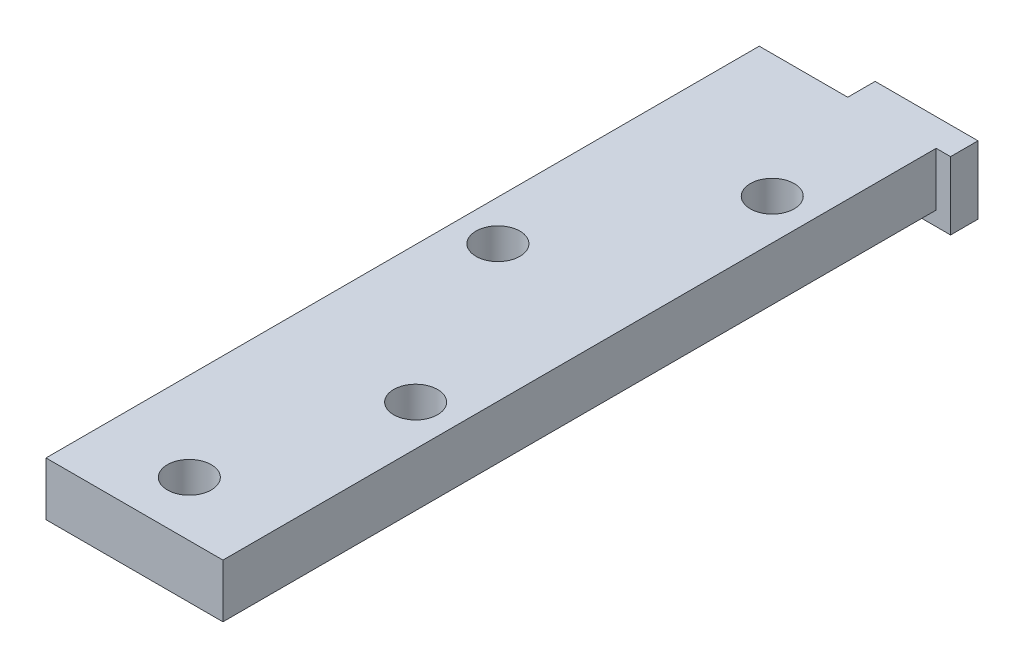
ISO-10303-21;
HEADER;
FILE_DESCRIPTION(('STEP AP214'),'2;1');
FILE_NAME('part.step','',(''),(''),'','','');
FILE_SCHEMA(('AUTOMOTIVE_DESIGN { 1 0 10303 214 1 1 1 1 }'));
ENDSEC;
DATA;
#1=APPLICATION_CONTEXT('core data for automotive mechanical design processes');
#2=APPLICATION_PROTOCOL_DEFINITION('international standard','automotive_design',2000,#1);
#3=PRODUCT_CONTEXT('',#1,'mechanical');
#4=PRODUCT('Part','Part','',(#3));
#5=PRODUCT_RELATED_PRODUCT_CATEGORY('part','',(#4));
#6=PRODUCT_DEFINITION_FORMATION('','',#4);
#7=PRODUCT_DEFINITION_CONTEXT('part definition',#1,'design');
#8=PRODUCT_DEFINITION('design','',#6,#7);
#9=PRODUCT_DEFINITION_SHAPE('','',#8);
#10=(LENGTH_UNIT() NAMED_UNIT(*) SI_UNIT(.MILLI.,.METRE.));
#11=(NAMED_UNIT(*) PLANE_ANGLE_UNIT() SI_UNIT($,.RADIAN.));
#12=(NAMED_UNIT(*) SI_UNIT($,.STERADIAN.) SOLID_ANGLE_UNIT());
#13=UNCERTAINTY_MEASURE_WITH_UNIT(LENGTH_MEASURE(1.E-05),#10,'distance_accuracy_value','');
#14=(GEOMETRIC_REPRESENTATION_CONTEXT(3) GLOBAL_UNCERTAINTY_ASSIGNED_CONTEXT((#13)) GLOBAL_UNIT_ASSIGNED_CONTEXT((#10,
#11,#12)) REPRESENTATION_CONTEXT('',''));
#15=CARTESIAN_POINT('',(0.,0.,0.));
#16=DIRECTION('',(0.,0.,1.));
#17=DIRECTION('',(1.,0.,0.));
#18=AXIS2_PLACEMENT_3D('',#15,#16,#17);
#19=CARTESIAN_POINT('',(7.5,-3.,2.));
#20=DIRECTION('',(-1.,0.,0.));
#21=DIRECTION('',(0.,0.,1.));
#22=AXIS2_PLACEMENT_3D('',#19,#20,#21);
#23=PLANE('',#22);
#24=DIRECTION('',(0.,1.,0.));
#25=VECTOR('',#24,1.);
#26=CARTESIAN_POINT('',(7.5,-3.,0.));
#27=LINE('',#26,#25);
#28=CARTESIAN_POINT('',(7.5,-3.,0.));
#29=VERTEX_POINT('',#28);
#30=CARTESIAN_POINT('',(7.5,1.95,0.));
#31=VERTEX_POINT('',#30);
#32=EDGE_CURVE('E116',#29,#31,#27,.T.);
#33=ORIENTED_EDGE('',*,*,#32,.T.);
#34=DIRECTION('',(0.,0.,1.));
#35=VECTOR('',#34,1.);
#36=CARTESIAN_POINT('',(7.5,1.95,-8.));
#37=LINE('',#36,#35);
#38=CARTESIAN_POINT('',(7.5,1.95,2.));
#39=VERTEX_POINT('',#38);
#40=EDGE_CURVE('E103',#31,#39,#37,.T.);
#41=ORIENTED_EDGE('',*,*,#40,.T.);
#42=DIRECTION('',(0.,1.,0.));
#43=VECTOR('',#42,1.);
#44=CARTESIAN_POINT('',(7.5,-3.,2.));
#45=LINE('',#44,#43);
#46=CARTESIAN_POINT('',(7.5,-3.,2.));
#47=VERTEX_POINT('',#46);
#48=EDGE_CURVE('E114',#47,#39,#45,.T.);
#49=ORIENTED_EDGE('',*,*,#48,.F.);
#50=DIRECTION('',(0.,0.,-1.));
#51=VECTOR('',#50,1.);
#52=CARTESIAN_POINT('',(7.5,-3.,2.));
#53=LINE('',#52,#51);
#54=EDGE_CURVE('E135',#47,#29,#53,.T.);
#55=ORIENTED_EDGE('',*,*,#54,.T.);
#56=EDGE_LOOP('',(#33,#41,#49,#55));
#57=FACE_BOUND('',#56,.T.);
#58=ADVANCED_FACE('F36',(#57),#23,.F.);
#59=CARTESIAN_POINT('',(0.,3.,2.));
#60=DIRECTION('',(1.,0.,0.));
#61=DIRECTION('',(0.,1.,0.));
#62=AXIS2_PLACEMENT_3D('',#59,#60,#61);
#63=PLANE('',#62);
#64=DIRECTION('',(0.,-1.,0.));
#65=VECTOR('',#64,1.);
#66=CARTESIAN_POINT('',(0.,3.,2.));
#67=LINE('',#66,#65);
#68=CARTESIAN_POINT('',(0.,1.95,2.));
#69=VERTEX_POINT('',#68);
#70=CARTESIAN_POINT('',(0.,-1.95,2.));
#71=VERTEX_POINT('',#70);
#72=EDGE_CURVE('E126',#69,#71,#67,.T.);
#73=ORIENTED_EDGE('',*,*,#72,.F.);
#74=DIRECTION('',(0.,0.,1.));
#75=VECTOR('',#74,1.);
#76=CARTESIAN_POINT('',(0.,1.95,-8.));
#77=LINE('',#76,#75);
#78=CARTESIAN_POINT('',(0.,1.95,0.));
#79=VERTEX_POINT('',#78);
#80=EDGE_CURVE('E57',#79,#69,#77,.T.);
#81=ORIENTED_EDGE('',*,*,#80,.F.);
#82=DIRECTION('',(0.,-1.,0.));
#83=VECTOR('',#82,1.);
#84=CARTESIAN_POINT('',(0.,3.,0.));
#85=LINE('',#84,#83);
#86=CARTESIAN_POINT('',(0.,-3.,0.));
#87=VERTEX_POINT('',#86);
#88=EDGE_CURVE('E128',#79,#87,#85,.T.);
#89=ORIENTED_EDGE('',*,*,#88,.T.);
#90=DIRECTION('',(0.,0.,-1.));
#91=VECTOR('',#90,1.);
#92=CARTESIAN_POINT('',(0.,-3.,2.));
#93=LINE('',#92,#91);
#94=CARTESIAN_POINT('',(0.,-3.,2.));
#95=VERTEX_POINT('',#94);
#96=EDGE_CURVE('E139',#95,#87,#93,.T.);
#97=ORIENTED_EDGE('',*,*,#96,.F.);
#98=EDGE_CURVE('E123',#71,#95,#67,.T.);
#99=ORIENTED_EDGE('',*,*,#98,.F.);
#100=EDGE_LOOP('',(#73,#81,#89,#97,#99));
#101=FACE_BOUND('',#100,.T.);
#102=ADVANCED_FACE('F201',(#101),#63,.F.);
#103=CARTESIAN_POINT('',(7.5,-3.,2.));
#104=DIRECTION('',(0.,1.,0.));
#105=DIRECTION('',(-1.,0.,0.));
#106=AXIS2_PLACEMENT_3D('',#103,#104,#105);
#107=PLANE('',#106);
#108=DIRECTION('',(1.,0.,0.));
#109=VECTOR('',#108,1.);
#110=CARTESIAN_POINT('',(7.5,-3.,0.));
#111=LINE('',#110,#109);
#112=EDGE_CURVE('E124',#87,#29,#111,.T.);
#113=ORIENTED_EDGE('',*,*,#112,.T.);
#114=ORIENTED_EDGE('',*,*,#54,.F.);
#115=DIRECTION('',(1.,0.,0.));
#116=VECTOR('',#115,1.);
#117=CARTESIAN_POINT('',(7.5,-3.,2.));
#118=LINE('',#117,#116);
#119=EDGE_CURVE('E121',#95,#47,#118,.T.);
#120=ORIENTED_EDGE('',*,*,#119,.F.);
#121=ORIENTED_EDGE('',*,*,#96,.T.);
#122=EDGE_LOOP('',(#113,#114,#120,#121));
#123=FACE_BOUND('',#122,.T.);
#124=ADVANCED_FACE('F206',(#123),#107,.F.);
#125=CARTESIAN_POINT('',(0.,0.,2.));
#126=DIRECTION('',(0.,0.,1.));
#127=DIRECTION('',(1.,0.,0.));
#128=AXIS2_PLACEMENT_3D('',#125,#126,#127);
#129=PLANE('',#128);
#130=DIRECTION('',(1.,0.,0.));
#131=VECTOR('',#130,1.);
#132=CARTESIAN_POINT('',(0.,1.95,2.));
#133=LINE('',#132,#131);
#134=CARTESIAN_POINT('',(6.45,1.95,2.));
#135=VERTEX_POINT('',#134);
#136=EDGE_CURVE('E100',#135,#39,#133,.T.);
#137=ORIENTED_EDGE('',*,*,#136,.F.);
#138=DIRECTION('',(0.,1.,0.));
#139=VECTOR('',#138,1.);
#140=CARTESIAN_POINT('',(6.45,-1.95,2.));
#141=LINE('',#140,#139);
#142=CARTESIAN_POINT('',(6.45,-1.95,2.));
#143=VERTEX_POINT('',#142);
#144=EDGE_CURVE('E164',#143,#135,#141,.T.);
#145=ORIENTED_EDGE('',*,*,#144,.F.);
#146=DIRECTION('',(1.,0.,0.));
#147=VECTOR('',#146,1.);
#148=CARTESIAN_POINT('',(6.45,-1.95,2.));
#149=LINE('',#148,#147);
#150=EDGE_CURVE('E43',#71,#143,#149,.T.);
#151=ORIENTED_EDGE('',*,*,#150,.F.);
#152=ORIENTED_EDGE('',*,*,#98,.T.);
#153=ORIENTED_EDGE('',*,*,#119,.T.);
#154=ORIENTED_EDGE('',*,*,#48,.T.);
#155=EDGE_LOOP('',(#137,#145,#151,#152,#153,#154));
#156=FACE_BOUND('',#155,.T.);
#157=ADVANCED_FACE('F119',(#156),#129,.T.);
#158=CARTESIAN_POINT('',(0.,0.,0.));
#159=DIRECTION('',(0.,0.,1.));
#160=DIRECTION('',(1.,0.,0.));
#161=AXIS2_PLACEMENT_3D('',#158,#159,#160);
#162=PLANE('',#161);
#163=ORIENTED_EDGE('',*,*,#88,.F.);
#164=DIRECTION('',(1.,0.,0.));
#165=VECTOR('',#164,1.);
#166=CARTESIAN_POINT('',(0.,1.95,0.));
#167=LINE('',#166,#165);
#168=EDGE_CURVE('E11',#79,#31,#167,.T.);
#169=ORIENTED_EDGE('',*,*,#168,.T.);
#170=ORIENTED_EDGE('',*,*,#32,.F.);
#171=ORIENTED_EDGE('',*,*,#112,.F.);
#172=EDGE_LOOP('',(#163,#169,#170,#171));
#173=FACE_BOUND('',#172,.T.);
#174=ADVANCED_FACE('F208',(#173),#162,.F.);
#175=CARTESIAN_POINT('',(0.,0.,2.));
#176=DIRECTION('',(0.,0.,1.));
#177=DIRECTION('',(1.,0.,0.));
#178=AXIS2_PLACEMENT_3D('',#175,#176,#177);
#179=PLANE('',#178);
#180=DIRECTION('',(-1.,0.,0.));
#181=VECTOR('',#180,1.);
#182=CARTESIAN_POINT('',(6.45,1.95,2.));
#183=LINE('',#182,#181);
#184=CARTESIAN_POINT('',(-6.45,1.95,2.));
#185=VERTEX_POINT('',#184);
#186=EDGE_CURVE('E171',#69,#185,#183,.T.);
#187=ORIENTED_EDGE('',*,*,#186,.F.);
#188=ORIENTED_EDGE('',*,*,#72,.T.);
#189=CARTESIAN_POINT('',(-6.45,-1.95,2.));
#190=VERTEX_POINT('',#189);
#191=EDGE_CURVE('E157',#190,#71,#149,.T.);
#192=ORIENTED_EDGE('',*,*,#191,.F.);
#193=DIRECTION('',(0.,-1.,0.));
#194=VECTOR('',#193,1.);
#195=CARTESIAN_POINT('',(-6.45,-1.95,2.));
#196=LINE('',#195,#194);
#197=EDGE_CURVE('E153',#185,#190,#196,.T.);
#198=ORIENTED_EDGE('',*,*,#197,.F.);
#199=EDGE_LOOP('',(#187,#188,#192,#198));
#200=FACE_BOUND('',#199,.T.);
#201=ADVANCED_FACE('F199',(#200),#179,.F.);
#202=CARTESIAN_POINT('',(-6.45,-1.95,54.));
#203=DIRECTION('',(1.,0.,0.));
#204=DIRECTION('',(0.,0.,-1.));
#205=AXIS2_PLACEMENT_3D('',#202,#203,#204);
#206=PLANE('',#205);
#207=ORIENTED_EDGE('',*,*,#197,.T.);
#208=DIRECTION('',(0.,0.,-1.));
#209=VECTOR('',#208,1.);
#210=CARTESIAN_POINT('',(-6.45,-1.95,54.));
#211=LINE('',#210,#209);
#212=CARTESIAN_POINT('',(-6.45,-1.95,54.));
#213=VERTEX_POINT('',#212);
#214=EDGE_CURVE('E131',#213,#190,#211,.T.);
#215=ORIENTED_EDGE('',*,*,#214,.F.);
#216=DIRECTION('',(0.,-1.,0.));
#217=VECTOR('',#216,1.);
#218=CARTESIAN_POINT('',(-6.45,-1.95,54.));
#219=LINE('',#218,#217);
#220=CARTESIAN_POINT('',(-6.45,1.95,54.));
#221=VERTEX_POINT('',#220);
#222=EDGE_CURVE('E173',#221,#213,#219,.T.);
#223=ORIENTED_EDGE('',*,*,#222,.F.);
#224=DIRECTION('',(0.,0.,-1.));
#225=VECTOR('',#224,1.);
#226=CARTESIAN_POINT('',(-6.45,1.95,54.));
#227=LINE('',#226,#225);
#228=EDGE_CURVE('E174',#221,#185,#227,.T.);
#229=ORIENTED_EDGE('',*,*,#228,.T.);
#230=EDGE_LOOP('',(#207,#215,#223,#229));
#231=FACE_BOUND('',#230,.T.);
#232=ADVANCED_FACE('F187',(#231),#206,.F.);
#233=CARTESIAN_POINT('',(6.45,-1.95,54.));
#234=DIRECTION('',(0.,1.,0.));
#235=DIRECTION('',(-1.,0.,0.));
#236=AXIS2_PLACEMENT_3D('',#233,#234,#235);
#237=PLANE('',#236);
#238=CARTESIAN_POINT('',(0.,-1.95,50.));
#239=DIRECTION('',(0.,-1.,0.));
#240=DIRECTION('',(1.,0.,0.));
#241=AXIS2_PLACEMENT_3D('',#238,#239,#240);
#242=CIRCLE('',#241,1.6);
#243=CARTESIAN_POINT('',(1.6,-1.95,50.));
#244=VERTEX_POINT('',#243);
#245=EDGE_CURVE('E117',#244,#244,#242,.T.);
#246=ORIENTED_EDGE('',*,*,#245,.F.);
#247=EDGE_LOOP('',(#246));
#248=FACE_BOUND('',#247,.T.);
#249=CARTESIAN_POINT('',(-3.5,-1.95,24.));
#250=DIRECTION('',(0.,-1.,0.));
#251=DIRECTION('',(1.,0.,0.));
#252=AXIS2_PLACEMENT_3D('',#249,#250,#251);
#253=CIRCLE('',#252,1.6);
#254=CARTESIAN_POINT('',(-1.9,-1.95,24.));
#255=VERTEX_POINT('',#254);
#256=EDGE_CURVE('E347',#255,#255,#253,.T.);
#257=ORIENTED_EDGE('',*,*,#256,.F.);
#258=EDGE_LOOP('',(#257));
#259=FACE_BOUND('',#258,.T.);
#260=CARTESIAN_POINT('',(3.5,-1.95,11.));
#261=DIRECTION('',(0.,-1.,0.));
#262=DIRECTION('',(1.,0.,0.));
#263=AXIS2_PLACEMENT_3D('',#260,#261,#262);
#264=CIRCLE('',#263,1.6);
#265=CARTESIAN_POINT('',(5.1,-1.95,11.));
#266=VERTEX_POINT('',#265);
#267=EDGE_CURVE('E351',#266,#266,#264,.T.);
#268=ORIENTED_EDGE('',*,*,#267,.F.);
#269=EDGE_LOOP('',(#268));
#270=FACE_BOUND('',#269,.T.);
#271=CARTESIAN_POINT('',(3.5,-1.95,37.));
#272=DIRECTION('',(0.,-1.,0.));
#273=DIRECTION('',(1.,0.,0.));
#274=AXIS2_PLACEMENT_3D('',#271,#272,#273);
#275=CIRCLE('',#274,1.6);
#276=CARTESIAN_POINT('',(5.1,-1.95,37.));
#277=VERTEX_POINT('',#276);
#278=EDGE_CURVE('E146',#277,#277,#275,.T.);
#279=ORIENTED_EDGE('',*,*,#278,.F.);
#280=EDGE_LOOP('',(#279));
#281=FACE_BOUND('',#280,.T.);
#282=ORIENTED_EDGE('',*,*,#191,.T.);
#283=ORIENTED_EDGE('',*,*,#150,.T.);
#284=DIRECTION('',(0.,0.,-1.));
#285=VECTOR('',#284,1.);
#286=CARTESIAN_POINT('',(6.45,-1.95,54.));
#287=LINE('',#286,#285);
#288=CARTESIAN_POINT('',(6.45,-1.95,54.));
#289=VERTEX_POINT('',#288);
#290=EDGE_CURVE('E176',#289,#143,#287,.T.);
#291=ORIENTED_EDGE('',*,*,#290,.F.);
#292=DIRECTION('',(1.,0.,0.));
#293=VECTOR('',#292,1.);
#294=CARTESIAN_POINT('',(6.45,-1.95,54.));
#295=LINE('',#294,#293);
#296=EDGE_CURVE('E184',#213,#289,#295,.T.);
#297=ORIENTED_EDGE('',*,*,#296,.F.);
#298=ORIENTED_EDGE('',*,*,#214,.T.);
#299=EDGE_LOOP('',(#282,#283,#291,#297,#298));
#300=FACE_BOUND('',#299,.T.);
#301=ADVANCED_FACE('F183',(#248,#259,#270,#281,#300),#237,.F.);
#302=CARTESIAN_POINT('',(6.45,-1.95,54.));
#303=DIRECTION('',(-1.,0.,0.));
#304=DIRECTION('',(0.,0.,1.));
#305=AXIS2_PLACEMENT_3D('',#302,#303,#304);
#306=PLANE('',#305);
#307=ORIENTED_EDGE('',*,*,#144,.T.);
#308=DIRECTION('',(0.,0.,-1.));
#309=VECTOR('',#308,1.);
#310=CARTESIAN_POINT('',(6.45,1.95,54.));
#311=LINE('',#310,#309);
#312=CARTESIAN_POINT('',(6.45,1.95,54.));
#313=VERTEX_POINT('',#312);
#314=EDGE_CURVE('E106',#313,#135,#311,.T.);
#315=ORIENTED_EDGE('',*,*,#314,.F.);
#316=DIRECTION('',(0.,1.,0.));
#317=VECTOR('',#316,1.);
#318=CARTESIAN_POINT('',(6.45,-1.95,54.));
#319=LINE('',#318,#317);
#320=EDGE_CURVE('E191',#289,#313,#319,.T.);
#321=ORIENTED_EDGE('',*,*,#320,.F.);
#322=ORIENTED_EDGE('',*,*,#290,.T.);
#323=EDGE_LOOP('',(#307,#315,#321,#322));
#324=FACE_BOUND('',#323,.T.);
#325=ADVANCED_FACE('F251',(#324),#306,.F.);
#326=CARTESIAN_POINT('',(6.45,1.95,54.));
#327=DIRECTION('',(0.,-1.,0.));
#328=DIRECTION('',(1.,0.,0.));
#329=AXIS2_PLACEMENT_3D('',#326,#327,#328);
#330=PLANE('',#329);
#331=CARTESIAN_POINT('',(0.,1.95000000000001,50.));
#332=DIRECTION('',(0.,-1.,0.));
#333=DIRECTION('',(1.,0.,0.));
#334=AXIS2_PLACEMENT_3D('',#331,#332,#333);
#335=CIRCLE('',#334,1.6);
#336=CARTESIAN_POINT('',(1.6,1.95000000000001,50.));
#337=VERTEX_POINT('',#336);
#338=EDGE_CURVE('E151',#337,#337,#335,.T.);
#339=ORIENTED_EDGE('',*,*,#338,.T.);
#340=EDGE_LOOP('',(#339));
#341=FACE_BOUND('',#340,.T.);
#342=CARTESIAN_POINT('',(-3.5,1.95000000000001,24.));
#343=DIRECTION('',(0.,-1.,0.));
#344=DIRECTION('',(1.,0.,0.));
#345=AXIS2_PLACEMENT_3D('',#342,#343,#344);
#346=CIRCLE('',#345,1.6);
#347=CARTESIAN_POINT('',(-1.9,1.95000000000001,24.));
#348=VERTEX_POINT('',#347);
#349=EDGE_CURVE('E149',#348,#348,#346,.T.);
#350=ORIENTED_EDGE('',*,*,#349,.T.);
#351=EDGE_LOOP('',(#350));
#352=FACE_BOUND('',#351,.T.);
#353=CARTESIAN_POINT('',(3.5,1.95000000000001,11.));
#354=DIRECTION('',(0.,-1.,0.));
#355=DIRECTION('',(1.,0.,0.));
#356=AXIS2_PLACEMENT_3D('',#353,#354,#355);
#357=CIRCLE('',#356,1.6);
#358=CARTESIAN_POINT('',(5.1,1.95000000000001,11.));
#359=VERTEX_POINT('',#358);
#360=EDGE_CURVE('E145',#359,#359,#357,.T.);
#361=ORIENTED_EDGE('',*,*,#360,.T.);
#362=EDGE_LOOP('',(#361));
#363=FACE_BOUND('',#362,.T.);
#364=CARTESIAN_POINT('',(3.5,1.95000000000001,37.));
#365=DIRECTION('',(0.,-1.,0.));
#366=DIRECTION('',(1.,0.,0.));
#367=AXIS2_PLACEMENT_3D('',#364,#365,#366);
#368=CIRCLE('',#367,1.6);
#369=CARTESIAN_POINT('',(5.1,1.95000000000001,37.));
#370=VERTEX_POINT('',#369);
#371=EDGE_CURVE('E142',#370,#370,#368,.T.);
#372=ORIENTED_EDGE('',*,*,#371,.T.);
#373=EDGE_LOOP('',(#372));
#374=FACE_BOUND('',#373,.T.);
#375=ORIENTED_EDGE('',*,*,#314,.T.);
#376=ORIENTED_EDGE('',*,*,#136,.T.);
#377=ORIENTED_EDGE('',*,*,#40,.F.);
#378=ORIENTED_EDGE('',*,*,#168,.F.);
#379=ORIENTED_EDGE('',*,*,#80,.T.);
#380=ORIENTED_EDGE('',*,*,#186,.T.);
#381=ORIENTED_EDGE('',*,*,#228,.F.);
#382=DIRECTION('',(-1.,0.,0.));
#383=VECTOR('',#382,1.);
#384=CARTESIAN_POINT('',(6.45,1.95,54.));
#385=LINE('',#384,#383);
#386=EDGE_CURVE('E167',#313,#221,#385,.T.);
#387=ORIENTED_EDGE('',*,*,#386,.F.);
#388=EDGE_LOOP('',(#375,#376,#377,#378,#379,#380,#381,#387));
#389=FACE_BOUND('',#388,.T.);
#390=ADVANCED_FACE('F102',(#341,#352,#363,#374,#389),#330,.F.);
#391=CARTESIAN_POINT('',(0.,0.,54.));
#392=DIRECTION('',(0.,0.,1.));
#393=DIRECTION('',(1.,0.,0.));
#394=AXIS2_PLACEMENT_3D('',#391,#392,#393);
#395=PLANE('',#394);
#396=ORIENTED_EDGE('',*,*,#222,.T.);
#397=ORIENTED_EDGE('',*,*,#296,.T.);
#398=ORIENTED_EDGE('',*,*,#320,.T.);
#399=ORIENTED_EDGE('',*,*,#386,.T.);
#400=EDGE_LOOP('',(#396,#397,#398,#399));
#401=FACE_BOUND('',#400,.T.);
#402=ADVANCED_FACE('F195',(#401),#395,.T.);
#403=CARTESIAN_POINT('',(3.49999999999995,354.05,37.));
#404=DIRECTION('',(0.,-1.,0.));
#405=DIRECTION('',(1.,0.,0.));
#406=AXIS2_PLACEMENT_3D('',#403,#404,#405);
#407=CYLINDRICAL_SURFACE('',#406,1.6);
#408=ORIENTED_EDGE('',*,*,#278,.T.);
#409=EDGE_LOOP('',(#408));
#410=FACE_BOUND('',#409,.T.);
#411=ORIENTED_EDGE('',*,*,#371,.F.);
#412=EDGE_LOOP('',(#411));
#413=FACE_BOUND('',#412,.T.);
#414=ADVANCED_FACE('F275',(#410,#413),#407,.F.);
#415=CARTESIAN_POINT('',(3.49999999999995,354.05,11.));
#416=DIRECTION('',(0.,-1.,0.));
#417=DIRECTION('',(1.,0.,0.));
#418=AXIS2_PLACEMENT_3D('',#415,#416,#417);
#419=CYLINDRICAL_SURFACE('',#418,1.6);
#420=ORIENTED_EDGE('',*,*,#267,.T.);
#421=EDGE_LOOP('',(#420));
#422=FACE_BOUND('',#421,.T.);
#423=ORIENTED_EDGE('',*,*,#360,.F.);
#424=EDGE_LOOP('',(#423));
#425=FACE_BOUND('',#424,.T.);
#426=ADVANCED_FACE('F283',(#422,#425),#419,.F.);
#427=CARTESIAN_POINT('',(-3.50000000000005,354.05,24.));
#428=DIRECTION('',(0.,-1.,0.));
#429=DIRECTION('',(1.,0.,0.));
#430=AXIS2_PLACEMENT_3D('',#427,#428,#429);
#431=CYLINDRICAL_SURFACE('',#430,1.6);
#432=ORIENTED_EDGE('',*,*,#256,.T.);
#433=EDGE_LOOP('',(#432));
#434=FACE_BOUND('',#433,.T.);
#435=ORIENTED_EDGE('',*,*,#349,.F.);
#436=EDGE_LOOP('',(#435));
#437=FACE_BOUND('',#436,.T.);
#438=ADVANCED_FACE('F291',(#434,#437),#431,.F.);
#439=CARTESIAN_POINT('',(0.,354.05,50.));
#440=DIRECTION('',(0.,-1.,0.));
#441=DIRECTION('',(1.,0.,0.));
#442=AXIS2_PLACEMENT_3D('',#439,#440,#441);
#443=CYLINDRICAL_SURFACE('',#442,1.6);
#444=ORIENTED_EDGE('',*,*,#245,.T.);
#445=EDGE_LOOP('',(#444));
#446=FACE_BOUND('',#445,.T.);
#447=ORIENTED_EDGE('',*,*,#338,.F.);
#448=EDGE_LOOP('',(#447));
#449=FACE_BOUND('',#448,.T.);
#450=ADVANCED_FACE('F299',(#446,#449),#443,.F.);
#451=CLOSED_SHELL('',(#58,#102,#124,#157,#174,#201,#232,#301,#325,#390,#402,#414,#426,#438,#450));
#452=MANIFOLD_SOLID_BREP('B2',#451);
#453=ADVANCED_BREP_SHAPE_REPRESENTATION('',(#18,#452),#14);
#454=SHAPE_DEFINITION_REPRESENTATION(#9,#453);
ENDSEC;
END-ISO-10303-21;
